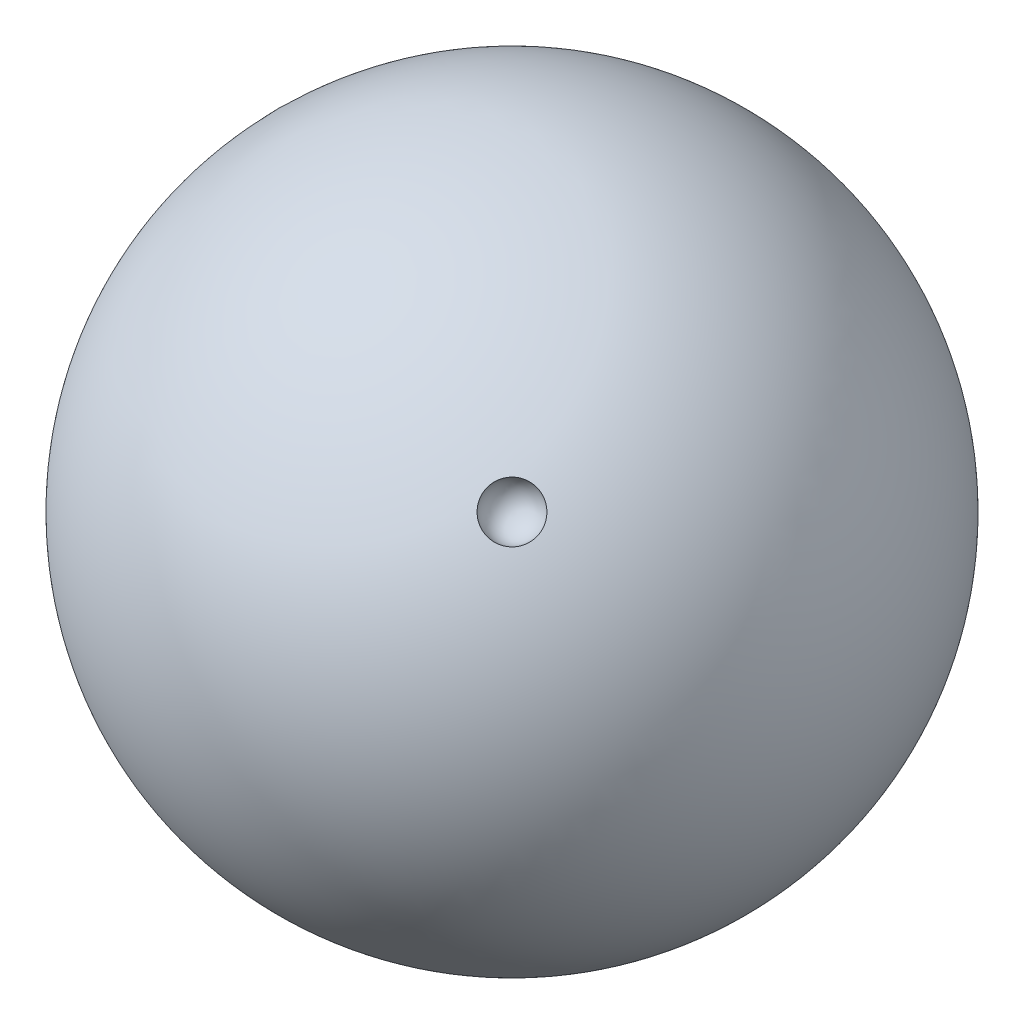
ISO-10303-21;
HEADER;
FILE_DESCRIPTION(('STEP AP214'),'2;1');
FILE_NAME('part.step','',(''),(''),'','','');
FILE_SCHEMA(('AUTOMOTIVE_DESIGN { 1 0 10303 214 1 1 1 1 }'));
ENDSEC;
DATA;
#1=APPLICATION_CONTEXT('core data for automotive mechanical design processes');
#2=APPLICATION_PROTOCOL_DEFINITION('international standard','automotive_design',2000,#1);
#3=PRODUCT_CONTEXT('',#1,'mechanical');
#4=PRODUCT('Part','Part','',(#3));
#5=PRODUCT_RELATED_PRODUCT_CATEGORY('part','',(#4));
#6=PRODUCT_DEFINITION_FORMATION('','',#4);
#7=PRODUCT_DEFINITION_CONTEXT('part definition',#1,'design');
#8=PRODUCT_DEFINITION('design','',#6,#7);
#9=PRODUCT_DEFINITION_SHAPE('','',#8);
#10=(LENGTH_UNIT() NAMED_UNIT(*) SI_UNIT(.MILLI.,.METRE.));
#11=(NAMED_UNIT(*) PLANE_ANGLE_UNIT() SI_UNIT($,.RADIAN.));
#12=(NAMED_UNIT(*) SI_UNIT($,.STERADIAN.) SOLID_ANGLE_UNIT());
#13=UNCERTAINTY_MEASURE_WITH_UNIT(LENGTH_MEASURE(1.E-05),#10,'distance_accuracy_value','');
#14=(GEOMETRIC_REPRESENTATION_CONTEXT(3) GLOBAL_UNCERTAINTY_ASSIGNED_CONTEXT((#13)) GLOBAL_UNIT_ASSIGNED_CONTEXT((#10,
#11,#12)) REPRESENTATION_CONTEXT('',''));
#15=CARTESIAN_POINT('',(0.,0.,0.));
#16=DIRECTION('',(0.,0.,1.));
#17=DIRECTION('',(1.,0.,0.));
#18=AXIS2_PLACEMENT_3D('',#15,#16,#17);
#19=CARTESIAN_POINT('',(0.,0.,0.));
#20=DIRECTION('',(0.,-1.,0.));
#21=DIRECTION('',(-1.,0.,0.));
#22=AXIS2_PLACEMENT_3D('',#19,#20,#21);
#23=SPHERICAL_SURFACE('',#22,40.);
#24=CARTESIAN_POINT('',(0.,0.,0.));
#25=DIRECTION('',(0.577350269189626,0.577350269189628,0.577350269189624));
#26=DIRECTION('',(-0.707106781186549,0.707106781186546,0.));
#27=AXIS2_PLACEMENT_3D('',#24,#25,#26);
#28=SPHERICAL_SURFACE('',#27,40.);
#29=CARTESIAN_POINT('',(23.0290588623012,23.0290588623013,23.0290588623011));
#30=DIRECTION('',(0.577350269189626,0.577350269189628,0.577350269189624));
#31=DIRECTION('',(-0.707106781186549,0.707106781186546,0.));
#32=AXIS2_PLACEMENT_3D('',#29,#30,#31);
#33=CIRCLE('',#32,2.99788988290098);
#34=CARTESIAN_POINT('',(20.9092305968514,25.1488871277511,23.0290588623011));
#35=VERTEX_POINT('',#34);
#36=EDGE_CURVE('E10',#35,#35,#33,.F.);
#37=ORIENTED_EDGE('',*,*,#36,.T.);
#38=EDGE_LOOP('',(#37));
#39=FACE_BOUND('',#38,.T.);
#40=ADVANCED_FACE('F34',(#39),#28,.T.);
#41=CARTESIAN_POINT('',(23.094010767585,23.0940107675851,23.0940107675849));
#42=DIRECTION('',(0.648708527246586,-0.75375260433757,0.105044077090987));
#43=DIRECTION('',(-0.495826495201933,-0.313884816646164,0.8097113118481));
#44=AXIS2_PLACEMENT_3D('',#41,#42,#43);
#45=SPHERICAL_SURFACE('',#44,3.);
#46=CARTESIAN_POINT('',(23.094010767585,23.0940107675851,23.0940107675849));
#47=DIRECTION('',(0.577350269189626,0.577350269189628,0.577350269189624));
#48=DIRECTION('',(-0.707106781186549,0.707106781186546,0.));
#49=AXIS2_PLACEMENT_3D('',#46,#47,#48);
#50=SPHERICAL_SURFACE('',#49,3.);
#51=ORIENTED_EDGE('',*,*,#36,.F.);
#52=EDGE_LOOP('',(#51));
#53=FACE_BOUND('',#52,.T.);
#54=ADVANCED_FACE('F42',(#53),#50,.F.);
#55=CLOSED_SHELL('',(#40,#54));
#56=MANIFOLD_SOLID_BREP('B2',#55);
#57=ADVANCED_BREP_SHAPE_REPRESENTATION('',(#18,#56),#14);
#58=SHAPE_DEFINITION_REPRESENTATION(#9,#57);
ENDSEC;
END-ISO-10303-21;
